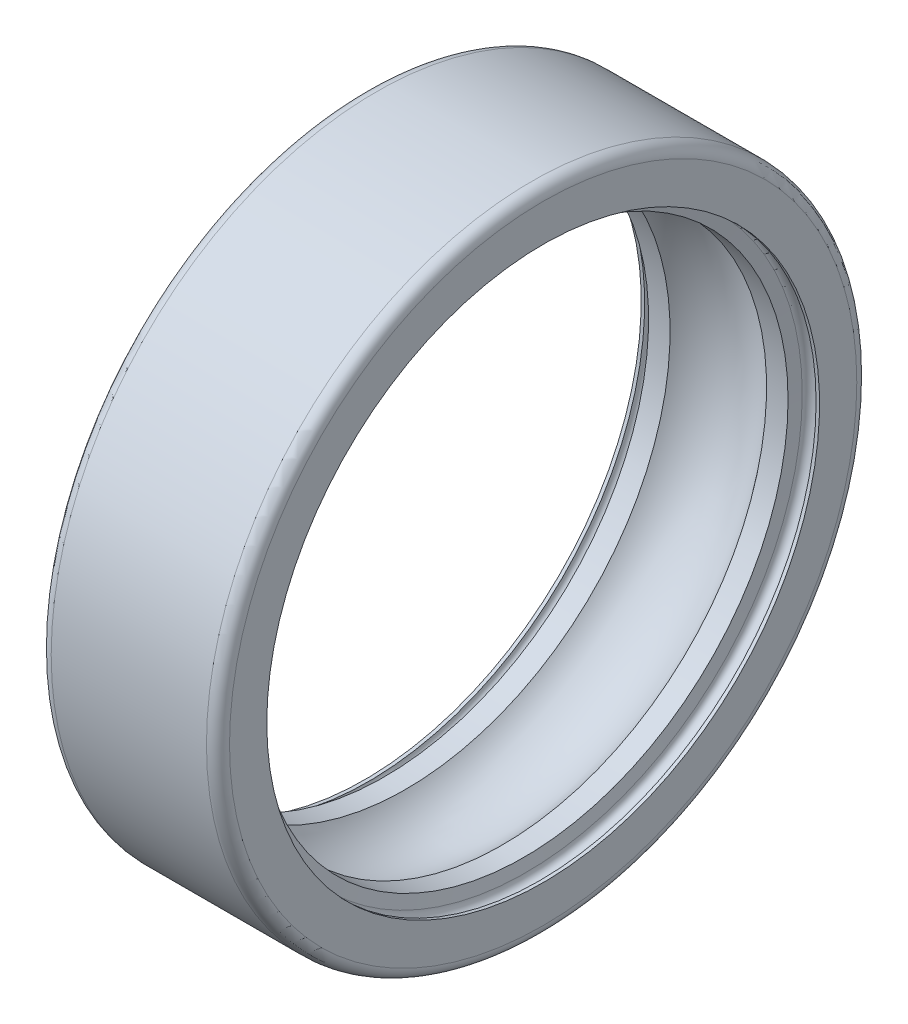
ISO-10303-21;
HEADER;
FILE_DESCRIPTION(('STEP AP214'),'2;1');
FILE_NAME('part.step','',(''),(''),'','','');
FILE_SCHEMA(('AUTOMOTIVE_DESIGN { 1 0 10303 214 1 1 1 1 }'));
ENDSEC;
DATA;
#1=APPLICATION_CONTEXT('core data for automotive mechanical design processes');
#2=APPLICATION_PROTOCOL_DEFINITION('international standard','automotive_design',2000,#1);
#3=PRODUCT_CONTEXT('',#1,'mechanical');
#4=PRODUCT('Part','Part','',(#3));
#5=PRODUCT_RELATED_PRODUCT_CATEGORY('part','',(#4));
#6=PRODUCT_DEFINITION_FORMATION('','',#4);
#7=PRODUCT_DEFINITION_CONTEXT('part definition',#1,'design');
#8=PRODUCT_DEFINITION('design','',#6,#7);
#9=PRODUCT_DEFINITION_SHAPE('','',#8);
#10=(LENGTH_UNIT() NAMED_UNIT(*) SI_UNIT(.MILLI.,.METRE.));
#11=(NAMED_UNIT(*) PLANE_ANGLE_UNIT() SI_UNIT($,.RADIAN.));
#12=(NAMED_UNIT(*) SI_UNIT($,.STERADIAN.) SOLID_ANGLE_UNIT());
#13=UNCERTAINTY_MEASURE_WITH_UNIT(LENGTH_MEASURE(1.E-05),#10,'distance_accuracy_value','');
#14=(GEOMETRIC_REPRESENTATION_CONTEXT(3) GLOBAL_UNCERTAINTY_ASSIGNED_CONTEXT((#13)) GLOBAL_UNIT_ASSIGNED_CONTEXT((#10,
#11,#12)) REPRESENTATION_CONTEXT('',''));
#15=CARTESIAN_POINT('',(0.,0.,0.));
#16=DIRECTION('',(0.,0.,1.));
#17=DIRECTION('',(1.,0.,0.));
#18=AXIS2_PLACEMENT_3D('',#15,#16,#17);
#19=CARTESIAN_POINT('',(8.5,0.,0.));
#20=DIRECTION('',(1.,0.,0.));
#21=DIRECTION('',(0.,0.,-1.));
#22=AXIS2_PLACEMENT_3D('',#19,#20,#21);
#23=TOROIDAL_SURFACE('',#22,21.75,5.75);
#24=CARTESIAN_POINT('',(13.1,0.,0.));
#25=DIRECTION('',(-1.,0.,0.));
#26=DIRECTION('',(0.,0.,1.));
#27=AXIS2_PLACEMENT_3D('',#24,#25,#26);
#28=CIRCLE('',#27,25.2);
#29=CARTESIAN_POINT('',(13.1,0.,25.2));
#30=VERTEX_POINT('',#29);
#31=EDGE_CURVE('E123',#30,#30,#28,.F.);
#32=ORIENTED_EDGE('',*,*,#31,.T.);
#33=EDGE_LOOP('',(#32));
#34=FACE_BOUND('',#33,.T.);
#35=CARTESIAN_POINT('',(3.9,0.,0.));
#36=DIRECTION('',(-1.,0.,0.));
#37=DIRECTION('',(0.,0.,1.));
#38=AXIS2_PLACEMENT_3D('',#35,#36,#37);
#39=CIRCLE('',#38,25.2);
#40=CARTESIAN_POINT('',(3.9,0.,25.2));
#41=VERTEX_POINT('',#40);
#42=EDGE_CURVE('E128',#41,#41,#39,.T.);
#43=ORIENTED_EDGE('',*,*,#42,.T.);
#44=EDGE_LOOP('',(#43));
#45=FACE_BOUND('',#44,.T.);
#46=ADVANCED_FACE('F14',(#34,#45),#23,.F.);
#47=CARTESIAN_POINT('',(50.,0.,0.));
#48=DIRECTION('',(-1.,0.,0.));
#49=DIRECTION('',(0.,0.,1.));
#50=AXIS2_PLACEMENT_3D('',#47,#48,#49);
#51=CYLINDRICAL_SURFACE('',#50,25.2);
#52=CARTESIAN_POINT('',(1.85277602781474,0.,0.));
#53=DIRECTION('',(-1.,0.,0.));
#54=DIRECTION('',(0.,0.,1.));
#55=AXIS2_PLACEMENT_3D('',#52,#53,#54);
#56=CIRCLE('',#55,25.2);
#57=CARTESIAN_POINT('',(1.85277602781474,0.,25.2));
#58=VERTEX_POINT('',#57);
#59=EDGE_CURVE('E118',#58,#58,#56,.T.);
#60=ORIENTED_EDGE('',*,*,#59,.T.);
#61=EDGE_LOOP('',(#60));
#62=FACE_BOUND('',#61,.T.);
#63=ORIENTED_EDGE('',*,*,#42,.F.);
#64=EDGE_LOOP('',(#63));
#65=FACE_BOUND('',#64,.T.);
#66=ADVANCED_FACE('F242',(#62,#65),#51,.F.);
#67=CARTESIAN_POINT('',(50.,0.,0.));
#68=DIRECTION('',(-1.,0.,0.));
#69=DIRECTION('',(0.,0.,1.));
#70=AXIS2_PLACEMENT_3D('',#67,#68,#69);
#71=CYLINDRICAL_SURFACE('',#70,25.2);
#72=ORIENTED_EDGE('',*,*,#31,.F.);
#73=EDGE_LOOP('',(#72));
#74=FACE_BOUND('',#73,.T.);
#75=CARTESIAN_POINT('',(15.1472239721853,0.,0.));
#76=DIRECTION('',(1.,0.,0.));
#77=DIRECTION('',(0.,0.,-1.));
#78=AXIS2_PLACEMENT_3D('',#75,#76,#77);
#79=CIRCLE('',#78,25.2);
#80=CARTESIAN_POINT('',(15.1472239721853,0.,-25.2));
#81=VERTEX_POINT('',#80);
#82=EDGE_CURVE('E113',#81,#81,#79,.T.);
#83=ORIENTED_EDGE('',*,*,#82,.T.);
#84=EDGE_LOOP('',(#83));
#85=FACE_BOUND('',#84,.T.);
#86=ADVANCED_FACE('F232',(#74,#85),#71,.F.);
#87=CARTESIAN_POINT('',(1.65000000000001,0.,0.));
#88=DIRECTION('',(-1.,0.,0.));
#89=DIRECTION('',(0.,0.,1.));
#90=AXIS2_PLACEMENT_3D('',#87,#88,#89);
#91=CONICAL_SURFACE('',#90,26.3500000098348,1.39626340305795);
#92=CARTESIAN_POINT('',(1.65,0.,0.));
#93=DIRECTION('',(1.,0.,0.));
#94=DIRECTION('',(0.,0.,-1.));
#95=AXIS2_PLACEMENT_3D('',#92,#93,#94);
#96=CIRCLE('',#95,26.3500000098348);
#97=CARTESIAN_POINT('',(1.65,0.,-26.3500000098348));
#98=VERTEX_POINT('',#97);
#99=EDGE_CURVE('E107',#98,#98,#96,.F.);
#100=ORIENTED_EDGE('',*,*,#99,.T.);
#101=EDGE_LOOP('',(#100));
#102=FACE_BOUND('',#101,.T.);
#103=ORIENTED_EDGE('',*,*,#59,.F.);
#104=EDGE_LOOP('',(#103));
#105=FACE_BOUND('',#104,.T.);
#106=ADVANCED_FACE('F166',(#102,#105),#91,.F.);
#107=CARTESIAN_POINT('',(15.35,0.,0.));
#108=DIRECTION('',(1.,0.,0.));
#109=DIRECTION('',(0.,1.,0.));
#110=AXIS2_PLACEMENT_3D('',#107,#108,#109);
#111=CONICAL_SURFACE('',#110,26.35,1.39626340159546);
#112=ORIENTED_EDGE('',*,*,#82,.F.);
#113=EDGE_LOOP('',(#112));
#114=FACE_BOUND('',#113,.T.);
#115=CARTESIAN_POINT('',(15.35,0.,0.));
#116=DIRECTION('',(1.,0.,0.));
#117=DIRECTION('',(0.,0.,-1.));
#118=AXIS2_PLACEMENT_3D('',#115,#116,#117);
#119=CIRCLE('',#118,26.35);
#120=CARTESIAN_POINT('',(15.35,0.,-26.35));
#121=VERTEX_POINT('',#120);
#122=EDGE_CURVE('E103',#121,#121,#119,.T.);
#123=ORIENTED_EDGE('',*,*,#122,.T.);
#124=EDGE_LOOP('',(#123));
#125=FACE_BOUND('',#124,.T.);
#126=ADVANCED_FACE('F160',(#114,#125),#111,.F.);
#127=CARTESIAN_POINT('',(0.990000000000001,0.,0.));
#128=DIRECTION('',(1.,0.,0.));
#129=DIRECTION('',(0.,0.,-1.));
#130=AXIS2_PLACEMENT_3D('',#127,#128,#129);
#131=TOROIDAL_SURFACE('',#130,26.35,0.660000000000001);
#132=ORIENTED_EDGE('',*,*,#99,.F.);
#133=EDGE_LOOP('',(#132));
#134=FACE_BOUND('',#133,.T.);
#135=CARTESIAN_POINT('',(0.329999999999997,0.,0.));
#136=DIRECTION('',(-1.,0.,0.));
#137=DIRECTION('',(0.,0.,1.));
#138=AXIS2_PLACEMENT_3D('',#135,#136,#137);
#139=CIRCLE('',#138,26.35);
#140=CARTESIAN_POINT('',(0.329999999999997,0.,26.35));
#141=VERTEX_POINT('',#140);
#142=EDGE_CURVE('E106',#141,#141,#139,.T.);
#143=ORIENTED_EDGE('',*,*,#142,.T.);
#144=EDGE_LOOP('',(#143));
#145=FACE_BOUND('',#144,.T.);
#146=ADVANCED_FACE('F94',(#134,#145),#131,.F.);
#147=CARTESIAN_POINT('',(16.01,0.,0.));
#148=DIRECTION('',(1.,0.,0.));
#149=DIRECTION('',(0.,0.,-1.));
#150=AXIS2_PLACEMENT_3D('',#147,#148,#149);
#151=TOROIDAL_SURFACE('',#150,26.35,0.659999999999997);
#152=CARTESIAN_POINT('',(16.67,0.,0.));
#153=DIRECTION('',(-1.,0.,0.));
#154=DIRECTION('',(0.,0.,1.));
#155=AXIS2_PLACEMENT_3D('',#152,#153,#154);
#156=CIRCLE('',#155,26.35);
#157=CARTESIAN_POINT('',(16.67,0.,26.35));
#158=VERTEX_POINT('',#157);
#159=EDGE_CURVE('E140',#158,#158,#156,.F.);
#160=ORIENTED_EDGE('',*,*,#159,.T.);
#161=EDGE_LOOP('',(#160));
#162=FACE_BOUND('',#161,.T.);
#163=ORIENTED_EDGE('',*,*,#122,.F.);
#164=EDGE_LOOP('',(#163));
#165=FACE_BOUND('',#164,.T.);
#166=ADVANCED_FACE('F89',(#162,#165),#151,.F.);
#167=CARTESIAN_POINT('',(50.,0.,0.));
#168=DIRECTION('',(-1.,0.,0.));
#169=DIRECTION('',(0.,0.,1.));
#170=AXIS2_PLACEMENT_3D('',#167,#168,#169);
#171=CYLINDRICAL_SURFACE('',#170,26.35);
#172=CARTESIAN_POINT('',(0.,0.,0.));
#173=DIRECTION('',(-1.,0.,0.));
#174=DIRECTION('',(0.,0.,1.));
#175=AXIS2_PLACEMENT_3D('',#172,#173,#174);
#176=CIRCLE('',#175,26.35);
#177=CARTESIAN_POINT('',(0.,0.,26.35));
#178=VERTEX_POINT('',#177);
#179=EDGE_CURVE('E18',#178,#178,#176,.F.);
#180=ORIENTED_EDGE('',*,*,#179,.F.);
#181=EDGE_LOOP('',(#180));
#182=FACE_BOUND('',#181,.T.);
#183=ORIENTED_EDGE('',*,*,#142,.F.);
#184=EDGE_LOOP('',(#183));
#185=FACE_BOUND('',#184,.T.);
#186=ADVANCED_FACE('F85',(#182,#185),#171,.F.);
#187=CARTESIAN_POINT('',(50.,0.,0.));
#188=DIRECTION('',(-1.,0.,0.));
#189=DIRECTION('',(0.,0.,1.));
#190=AXIS2_PLACEMENT_3D('',#187,#188,#189);
#191=CYLINDRICAL_SURFACE('',#190,26.35);
#192=ORIENTED_EDGE('',*,*,#159,.F.);
#193=EDGE_LOOP('',(#192));
#194=FACE_BOUND('',#193,.T.);
#195=CARTESIAN_POINT('',(17.,0.,0.));
#196=DIRECTION('',(-1.,0.,0.));
#197=DIRECTION('',(0.,0.,1.));
#198=AXIS2_PLACEMENT_3D('',#195,#196,#197);
#199=CIRCLE('',#198,26.35);
#200=CARTESIAN_POINT('',(17.,0.,26.35));
#201=VERTEX_POINT('',#200);
#202=EDGE_CURVE('E135',#201,#201,#199,.T.);
#203=ORIENTED_EDGE('',*,*,#202,.F.);
#204=EDGE_LOOP('',(#203));
#205=FACE_BOUND('',#204,.T.);
#206=ADVANCED_FACE('F81',(#194,#205),#191,.F.);
#207=CARTESIAN_POINT('',(0.,29.9,0.));
#208=DIRECTION('',(-1.,0.,0.));
#209=DIRECTION('',(0.,0.,1.));
#210=AXIS2_PLACEMENT_3D('',#207,#208,#209);
#211=PLANE('',#210);
#212=CARTESIAN_POINT('',(0.,0.,0.));
#213=DIRECTION('',(1.,0.,0.));
#214=DIRECTION('',(0.,0.,-1.));
#215=AXIS2_PLACEMENT_3D('',#212,#213,#214);
#216=CIRCLE('',#215,29.9);
#217=CARTESIAN_POINT('',(0.,0.,-29.9));
#218=VERTEX_POINT('',#217);
#219=EDGE_CURVE('E65',#218,#218,#216,.T.);
#220=ORIENTED_EDGE('',*,*,#219,.F.);
#221=EDGE_LOOP('',(#220));
#222=FACE_BOUND('',#221,.T.);
#223=ORIENTED_EDGE('',*,*,#179,.T.);
#224=EDGE_LOOP('',(#223));
#225=FACE_BOUND('',#224,.T.);
#226=ADVANCED_FACE('F71',(#222,#225),#211,.T.);
#227=CARTESIAN_POINT('',(17.,26.35,0.));
#228=DIRECTION('',(1.,0.,0.));
#229=DIRECTION('',(0.,0.,-1.));
#230=AXIS2_PLACEMENT_3D('',#227,#228,#229);
#231=PLANE('',#230);
#232=ORIENTED_EDGE('',*,*,#202,.T.);
#233=EDGE_LOOP('',(#232));
#234=FACE_BOUND('',#233,.T.);
#235=CARTESIAN_POINT('',(17.,0.,0.));
#236=DIRECTION('',(-1.,0.,0.));
#237=DIRECTION('',(0.,0.,-1.));
#238=AXIS2_PLACEMENT_3D('',#235,#236,#237);
#239=CIRCLE('',#238,29.9);
#240=CARTESIAN_POINT('',(17.,0.,-29.9));
#241=VERTEX_POINT('',#240);
#242=EDGE_CURVE('E27',#241,#241,#239,.T.);
#243=ORIENTED_EDGE('',*,*,#242,.F.);
#244=EDGE_LOOP('',(#243));
#245=FACE_BOUND('',#244,.T.);
#246=ADVANCED_FACE('F80',(#234,#245),#231,.T.);
#247=CARTESIAN_POINT('',(1.1,0.,0.));
#248=DIRECTION('',(1.,0.,0.));
#249=DIRECTION('',(0.,0.,-1.));
#250=AXIS2_PLACEMENT_3D('',#247,#248,#249);
#251=TOROIDAL_SURFACE('',#250,29.9,1.1);
#252=CARTESIAN_POINT('',(1.1,0.,0.));
#253=DIRECTION('',(-1.,0.,0.));
#254=DIRECTION('',(0.,0.,1.));
#255=AXIS2_PLACEMENT_3D('',#252,#253,#254);
#256=CIRCLE('',#255,31.);
#257=CARTESIAN_POINT('',(1.1,0.,31.));
#258=VERTEX_POINT('',#257);
#259=EDGE_CURVE('E22',#258,#258,#256,.F.);
#260=ORIENTED_EDGE('',*,*,#259,.F.);
#261=EDGE_LOOP('',(#260));
#262=FACE_BOUND('',#261,.T.);
#263=ORIENTED_EDGE('',*,*,#219,.T.);
#264=EDGE_LOOP('',(#263));
#265=FACE_BOUND('',#264,.T.);
#266=ADVANCED_FACE('F45',(#262,#265),#251,.T.);
#267=CARTESIAN_POINT('',(15.9,0.,0.));
#268=DIRECTION('',(1.,0.,0.));
#269=DIRECTION('',(0.,0.,-1.));
#270=AXIS2_PLACEMENT_3D('',#267,#268,#269);
#271=TOROIDAL_SURFACE('',#270,29.9,1.1);
#272=ORIENTED_EDGE('',*,*,#242,.T.);
#273=EDGE_LOOP('',(#272));
#274=FACE_BOUND('',#273,.T.);
#275=CARTESIAN_POINT('',(15.9,0.,0.));
#276=DIRECTION('',(-1.,0.,0.));
#277=DIRECTION('',(0.,0.,1.));
#278=AXIS2_PLACEMENT_3D('',#275,#276,#277);
#279=CIRCLE('',#278,31.);
#280=CARTESIAN_POINT('',(15.9,0.,31.));
#281=VERTEX_POINT('',#280);
#282=EDGE_CURVE('E10',#281,#281,#279,.T.);
#283=ORIENTED_EDGE('',*,*,#282,.F.);
#284=EDGE_LOOP('',(#283));
#285=FACE_BOUND('',#284,.T.);
#286=ADVANCED_FACE('F39',(#274,#285),#271,.T.);
#287=CARTESIAN_POINT('',(50.,0.,0.));
#288=DIRECTION('',(-1.,0.,0.));
#289=DIRECTION('',(0.,0.,1.));
#290=AXIS2_PLACEMENT_3D('',#287,#288,#289);
#291=CYLINDRICAL_SURFACE('',#290,31.);
#292=ORIENTED_EDGE('',*,*,#282,.T.);
#293=EDGE_LOOP('',(#292));
#294=FACE_BOUND('',#293,.T.);
#295=ORIENTED_EDGE('',*,*,#259,.T.);
#296=EDGE_LOOP('',(#295));
#297=FACE_BOUND('',#296,.T.);
#298=ADVANCED_FACE('F44',(#294,#297),#291,.T.);
#299=CLOSED_SHELL('',(#46,#66,#86,#106,#126,#146,#166,#186,#206,#226,#246,#266,#286,#298));
#300=MANIFOLD_SOLID_BREP('B1',#299);
#301=ADVANCED_BREP_SHAPE_REPRESENTATION('',(#18,#300),#14);
#302=SHAPE_DEFINITION_REPRESENTATION(#9,#301);
ENDSEC;
END-ISO-10303-21;
